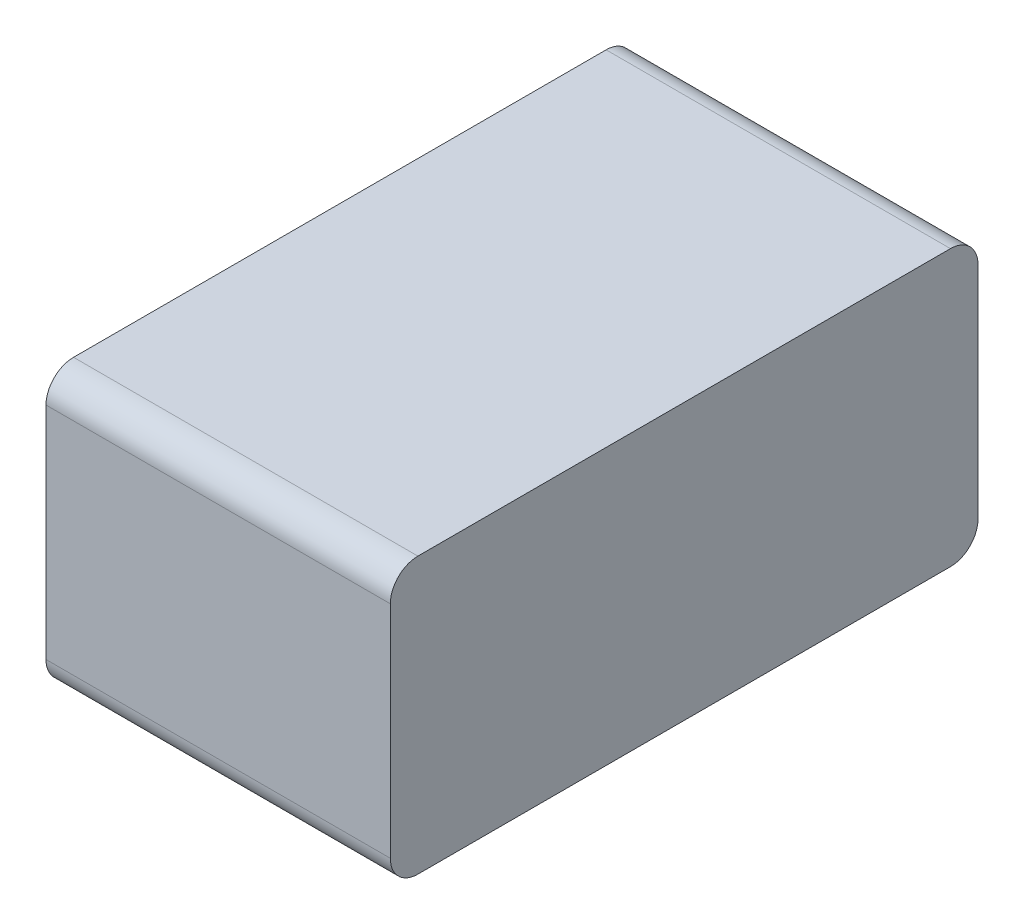
ISO-10303-21;
HEADER;
FILE_DESCRIPTION(('STEP AP214'),'2;1');
FILE_NAME('part.step','',(''),(''),'','','');
FILE_SCHEMA(('AUTOMOTIVE_DESIGN { 1 0 10303 214 1 1 1 1 }'));
ENDSEC;
DATA;
#1=APPLICATION_CONTEXT('core data for automotive mechanical design processes');
#2=APPLICATION_PROTOCOL_DEFINITION('international standard','automotive_design',2000,#1);
#3=PRODUCT_CONTEXT('',#1,'mechanical');
#4=PRODUCT('Part','Part','',(#3));
#5=PRODUCT_RELATED_PRODUCT_CATEGORY('part','',(#4));
#6=PRODUCT_DEFINITION_FORMATION('','',#4);
#7=PRODUCT_DEFINITION_CONTEXT('part definition',#1,'design');
#8=PRODUCT_DEFINITION('design','',#6,#7);
#9=PRODUCT_DEFINITION_SHAPE('','',#8);
#10=(LENGTH_UNIT() NAMED_UNIT(*) SI_UNIT(.MILLI.,.METRE.));
#11=(NAMED_UNIT(*) PLANE_ANGLE_UNIT() SI_UNIT($,.RADIAN.));
#12=(NAMED_UNIT(*) SI_UNIT($,.STERADIAN.) SOLID_ANGLE_UNIT());
#13=UNCERTAINTY_MEASURE_WITH_UNIT(LENGTH_MEASURE(1.E-05),#10,'distance_accuracy_value','');
#14=(GEOMETRIC_REPRESENTATION_CONTEXT(3) GLOBAL_UNCERTAINTY_ASSIGNED_CONTEXT((#13)) GLOBAL_UNIT_ASSIGNED_CONTEXT((#10,
#11,#12)) REPRESENTATION_CONTEXT('',''));
#15=CARTESIAN_POINT('',(0.,0.,0.));
#16=DIRECTION('',(0.,0.,1.));
#17=DIRECTION('',(1.,0.,0.));
#18=AXIS2_PLACEMENT_3D('',#15,#16,#17);
#19=CARTESIAN_POINT('',(37.5,-15.,32.));
#20=DIRECTION('',(0.,1.,0.));
#21=DIRECTION('',(0.,0.,1.));
#22=AXIS2_PLACEMENT_3D('',#19,#20,#21);
#23=PLANE('',#22);
#24=DIRECTION('',(0.,0.,-1.));
#25=VECTOR('',#24,1.);
#26=CARTESIAN_POINT('',(37.5,-15.,32.));
#27=LINE('',#26,#25);
#28=CARTESIAN_POINT('',(37.5,-15.,29.));
#29=VERTEX_POINT('',#28);
#30=CARTESIAN_POINT('',(37.5,-15.,-29.));
#31=VERTEX_POINT('',#30);
#32=EDGE_CURVE('E130',#29,#31,#27,.T.);
#33=ORIENTED_EDGE('',*,*,#32,.F.);
#34=DIRECTION('',(-1.,0.,0.));
#35=VECTOR('',#34,1.);
#36=CARTESIAN_POINT('',(37.5,-15.,29.));
#37=LINE('',#36,#35);
#38=CARTESIAN_POINT('',(0.,-15.,29.));
#39=VERTEX_POINT('',#38);
#40=EDGE_CURVE('E115',#29,#39,#37,.T.);
#41=ORIENTED_EDGE('',*,*,#40,.T.);
#42=DIRECTION('',(0.,0.,-1.));
#43=VECTOR('',#42,1.);
#44=CARTESIAN_POINT('',(0.,-15.,32.));
#45=LINE('',#44,#43);
#46=CARTESIAN_POINT('',(0.,-15.,-29.));
#47=VERTEX_POINT('',#46);
#48=EDGE_CURVE('E127',#39,#47,#45,.T.);
#49=ORIENTED_EDGE('',*,*,#48,.T.);
#50=DIRECTION('',(-1.,0.,0.));
#51=VECTOR('',#50,1.);
#52=CARTESIAN_POINT('',(37.5,-15.,-29.));
#53=LINE('',#52,#51);
#54=EDGE_CURVE('E132',#47,#31,#53,.F.);
#55=ORIENTED_EDGE('',*,*,#54,.T.);
#56=EDGE_LOOP('',(#33,#41,#49,#55));
#57=FACE_BOUND('',#56,.T.);
#58=ADVANCED_FACE('F45',(#57),#23,.F.);
#59=CARTESIAN_POINT('',(37.5,-15.,-32.));
#60=DIRECTION('',(0.,0.,1.));
#61=DIRECTION('',(1.,0.,0.));
#62=AXIS2_PLACEMENT_3D('',#59,#60,#61);
#63=PLANE('',#62);
#64=DIRECTION('',(0.,1.,0.));
#65=VECTOR('',#64,1.);
#66=CARTESIAN_POINT('',(0.,-15.,-32.));
#67=LINE('',#66,#65);
#68=CARTESIAN_POINT('',(0.,-12.,-32.));
#69=VERTEX_POINT('',#68);
#70=CARTESIAN_POINT('',(0.,12.,-32.));
#71=VERTEX_POINT('',#70);
#72=EDGE_CURVE('E136',#69,#71,#67,.T.);
#73=ORIENTED_EDGE('',*,*,#72,.T.);
#74=DIRECTION('',(-1.,0.,0.));
#75=VECTOR('',#74,1.);
#76=CARTESIAN_POINT('',(37.5,12.,-32.));
#77=LINE('',#76,#75);
#78=CARTESIAN_POINT('',(37.5,12.,-32.));
#79=VERTEX_POINT('',#78);
#80=EDGE_CURVE('E11',#71,#79,#77,.F.);
#81=ORIENTED_EDGE('',*,*,#80,.T.);
#82=DIRECTION('',(0.,1.,0.));
#83=VECTOR('',#82,1.);
#84=CARTESIAN_POINT('',(37.5,-15.,-32.));
#85=LINE('',#84,#83);
#86=CARTESIAN_POINT('',(37.5,-12.,-32.));
#87=VERTEX_POINT('',#86);
#88=EDGE_CURVE('E176',#87,#79,#85,.T.);
#89=ORIENTED_EDGE('',*,*,#88,.F.);
#90=DIRECTION('',(-1.,0.,0.));
#91=VECTOR('',#90,1.);
#92=CARTESIAN_POINT('',(37.5,-12.,-32.));
#93=LINE('',#92,#91);
#94=EDGE_CURVE('E53',#87,#69,#93,.T.);
#95=ORIENTED_EDGE('',*,*,#94,.T.);
#96=EDGE_LOOP('',(#73,#81,#89,#95));
#97=FACE_BOUND('',#96,.T.);
#98=ADVANCED_FACE('F174',(#97),#63,.F.);
#99=CARTESIAN_POINT('',(37.5,15.,-32.));
#100=DIRECTION('',(0.,-1.,0.));
#101=DIRECTION('',(0.,0.,-1.));
#102=AXIS2_PLACEMENT_3D('',#99,#100,#101);
#103=PLANE('',#102);
#104=DIRECTION('',(0.,0.,1.));
#105=VECTOR('',#104,1.);
#106=CARTESIAN_POINT('',(0.,15.,-32.));
#107=LINE('',#106,#105);
#108=CARTESIAN_POINT('',(0.,15.,-29.));
#109=VERTEX_POINT('',#108);
#110=CARTESIAN_POINT('',(0.,15.,29.));
#111=VERTEX_POINT('',#110);
#112=EDGE_CURVE('E140',#109,#111,#107,.T.);
#113=ORIENTED_EDGE('',*,*,#112,.T.);
#114=DIRECTION('',(-1.,0.,0.));
#115=VECTOR('',#114,1.);
#116=CARTESIAN_POINT('',(37.5,15.,29.));
#117=LINE('',#116,#115);
#118=CARTESIAN_POINT('',(37.5,15.,29.));
#119=VERTEX_POINT('',#118);
#120=EDGE_CURVE('E60',#111,#119,#117,.F.);
#121=ORIENTED_EDGE('',*,*,#120,.T.);
#122=DIRECTION('',(0.,0.,1.));
#123=VECTOR('',#122,1.);
#124=CARTESIAN_POINT('',(37.5,15.,-32.));
#125=LINE('',#124,#123);
#126=CARTESIAN_POINT('',(37.5,15.,-29.));
#127=VERTEX_POINT('',#126);
#128=EDGE_CURVE('E184',#127,#119,#125,.T.);
#129=ORIENTED_EDGE('',*,*,#128,.F.);
#130=DIRECTION('',(-1.,0.,0.));
#131=VECTOR('',#130,1.);
#132=CARTESIAN_POINT('',(37.5,15.,-29.));
#133=LINE('',#132,#131);
#134=EDGE_CURVE('E167',#127,#109,#133,.T.);
#135=ORIENTED_EDGE('',*,*,#134,.T.);
#136=EDGE_LOOP('',(#113,#121,#129,#135));
#137=FACE_BOUND('',#136,.T.);
#138=ADVANCED_FACE('F183',(#137),#103,.F.);
#139=CARTESIAN_POINT('',(37.5,15.,32.));
#140=DIRECTION('',(0.,0.,-1.));
#141=DIRECTION('',(-1.,0.,0.));
#142=AXIS2_PLACEMENT_3D('',#139,#140,#141);
#143=PLANE('',#142);
#144=DIRECTION('',(0.,-1.,0.));
#145=VECTOR('',#144,1.);
#146=CARTESIAN_POINT('',(0.,15.,32.));
#147=LINE('',#146,#145);
#148=CARTESIAN_POINT('',(0.,12.,32.));
#149=VERTEX_POINT('',#148);
#150=CARTESIAN_POINT('',(0.,-12.,32.));
#151=VERTEX_POINT('',#150);
#152=EDGE_CURVE('E150',#149,#151,#147,.T.);
#153=ORIENTED_EDGE('',*,*,#152,.T.);
#154=DIRECTION('',(-1.,0.,0.));
#155=VECTOR('',#154,1.);
#156=CARTESIAN_POINT('',(37.5,-12.,32.));
#157=LINE('',#156,#155);
#158=CARTESIAN_POINT('',(37.5,-12.,32.));
#159=VERTEX_POINT('',#158);
#160=EDGE_CURVE('E116',#151,#159,#157,.F.);
#161=ORIENTED_EDGE('',*,*,#160,.T.);
#162=DIRECTION('',(0.,-1.,0.));
#163=VECTOR('',#162,1.);
#164=CARTESIAN_POINT('',(37.5,15.,32.));
#165=LINE('',#164,#163);
#166=CARTESIAN_POINT('',(37.5,12.,32.));
#167=VERTEX_POINT('',#166);
#168=EDGE_CURVE('E146',#167,#159,#165,.T.);
#169=ORIENTED_EDGE('',*,*,#168,.F.);
#170=DIRECTION('',(-1.,0.,0.));
#171=VECTOR('',#170,1.);
#172=CARTESIAN_POINT('',(37.5,12.,32.));
#173=LINE('',#172,#171);
#174=EDGE_CURVE('E121',#167,#149,#173,.T.);
#175=ORIENTED_EDGE('',*,*,#174,.T.);
#176=EDGE_LOOP('',(#153,#161,#169,#175));
#177=FACE_BOUND('',#176,.T.);
#178=ADVANCED_FACE('F360',(#177),#143,.F.);
#179=CARTESIAN_POINT('',(37.5,0.,0.));
#180=DIRECTION('',(1.,0.,0.));
#181=DIRECTION('',(0.,0.,-1.));
#182=AXIS2_PLACEMENT_3D('',#179,#180,#181);
#183=PLANE('',#182);
#184=ORIENTED_EDGE('',*,*,#168,.T.);
#185=CARTESIAN_POINT('',(37.5,-12.,29.));
#186=DIRECTION('',(1.,0.,0.));
#187=DIRECTION('',(0.,0.,-1.));
#188=AXIS2_PLACEMENT_3D('',#185,#186,#187);
#189=CIRCLE('',#188,3.);
#190=EDGE_CURVE('E165',#159,#29,#189,.T.);
#191=ORIENTED_EDGE('',*,*,#190,.T.);
#192=ORIENTED_EDGE('',*,*,#32,.T.);
#193=CARTESIAN_POINT('',(37.5,-12.,-29.));
#194=DIRECTION('',(1.,0.,0.));
#195=DIRECTION('',(0.,0.,-1.));
#196=AXIS2_PLACEMENT_3D('',#193,#194,#195);
#197=CIRCLE('',#196,3.);
#198=EDGE_CURVE('E160',#31,#87,#197,.T.);
#199=ORIENTED_EDGE('',*,*,#198,.T.);
#200=ORIENTED_EDGE('',*,*,#88,.T.);
#201=CARTESIAN_POINT('',(37.5,12.,-29.));
#202=DIRECTION('',(1.,0.,0.));
#203=DIRECTION('',(0.,0.,-1.));
#204=AXIS2_PLACEMENT_3D('',#201,#202,#203);
#205=CIRCLE('',#204,3.);
#206=EDGE_CURVE('E67',#79,#127,#205,.T.);
#207=ORIENTED_EDGE('',*,*,#206,.T.);
#208=ORIENTED_EDGE('',*,*,#128,.T.);
#209=CARTESIAN_POINT('',(37.5,12.,29.));
#210=DIRECTION('',(1.,0.,0.));
#211=DIRECTION('',(0.,0.,-1.));
#212=AXIS2_PLACEMENT_3D('',#209,#210,#211);
#213=CIRCLE('',#212,3.);
#214=EDGE_CURVE('E163',#119,#167,#213,.T.);
#215=ORIENTED_EDGE('',*,*,#214,.T.);
#216=EDGE_LOOP('',(#184,#191,#192,#199,#200,#207,#208,#215));
#217=FACE_BOUND('',#216,.T.);
#218=ADVANCED_FACE('F209',(#217),#183,.T.);
#219=CARTESIAN_POINT('',(0.,0.,0.));
#220=DIRECTION('',(1.,0.,0.));
#221=DIRECTION('',(0.,0.,-1.));
#222=AXIS2_PLACEMENT_3D('',#219,#220,#221);
#223=PLANE('',#222);
#224=CARTESIAN_POINT('',(0.,3.,-20.));
#225=DIRECTION('',(-1.,0.,0.));
#226=DIRECTION('',(0.,0.,1.));
#227=AXIS2_PLACEMENT_3D('',#224,#225,#226);
#228=CIRCLE('',#227,5.5);
#229=CARTESIAN_POINT('',(0.,3.,-14.5));
#230=VERTEX_POINT('',#229);
#231=EDGE_CURVE('E143',#230,#230,#228,.T.);
#232=ORIENTED_EDGE('',*,*,#231,.F.);
#233=EDGE_LOOP('',(#232));
#234=FACE_BOUND('',#233,.T.);
#235=CARTESIAN_POINT('',(0.,3.,0.));
#236=DIRECTION('',(-1.,0.,0.));
#237=DIRECTION('',(0.,0.,1.));
#238=AXIS2_PLACEMENT_3D('',#235,#236,#237);
#239=CIRCLE('',#238,5.5);
#240=CARTESIAN_POINT('',(0.,3.,5.5));
#241=VERTEX_POINT('',#240);
#242=EDGE_CURVE('E199',#241,#241,#239,.T.);
#243=ORIENTED_EDGE('',*,*,#242,.F.);
#244=EDGE_LOOP('',(#243));
#245=FACE_BOUND('',#244,.T.);
#246=CARTESIAN_POINT('',(0.,3.,20.));
#247=DIRECTION('',(-1.,0.,0.));
#248=DIRECTION('',(0.,0.,1.));
#249=AXIS2_PLACEMENT_3D('',#246,#247,#248);
#250=CIRCLE('',#249,5.5);
#251=CARTESIAN_POINT('',(0.,3.,25.5));
#252=VERTEX_POINT('',#251);
#253=EDGE_CURVE('E193',#252,#252,#250,.T.);
#254=ORIENTED_EDGE('',*,*,#253,.F.);
#255=EDGE_LOOP('',(#254));
#256=FACE_BOUND('',#255,.T.);
#257=ORIENTED_EDGE('',*,*,#48,.F.);
#258=CARTESIAN_POINT('',(0.,-12.,29.));
#259=DIRECTION('',(1.,0.,0.));
#260=DIRECTION('',(0.,0.,-1.));
#261=AXIS2_PLACEMENT_3D('',#258,#259,#260);
#262=CIRCLE('',#261,3.);
#263=EDGE_CURVE('E111',#39,#151,#262,.F.);
#264=ORIENTED_EDGE('',*,*,#263,.T.);
#265=ORIENTED_EDGE('',*,*,#152,.F.);
#266=CARTESIAN_POINT('',(0.,12.,29.));
#267=DIRECTION('',(1.,0.,0.));
#268=DIRECTION('',(0.,0.,-1.));
#269=AXIS2_PLACEMENT_3D('',#266,#267,#268);
#270=CIRCLE('',#269,3.);
#271=EDGE_CURVE('E122',#149,#111,#270,.F.);
#272=ORIENTED_EDGE('',*,*,#271,.T.);
#273=ORIENTED_EDGE('',*,*,#112,.F.);
#274=CARTESIAN_POINT('',(0.,12.,-29.));
#275=DIRECTION('',(1.,0.,0.));
#276=DIRECTION('',(0.,0.,-1.));
#277=AXIS2_PLACEMENT_3D('',#274,#275,#276);
#278=CIRCLE('',#277,3.);
#279=EDGE_CURVE('E154',#109,#71,#278,.F.);
#280=ORIENTED_EDGE('',*,*,#279,.T.);
#281=ORIENTED_EDGE('',*,*,#72,.F.);
#282=CARTESIAN_POINT('',(0.,-12.,-29.));
#283=DIRECTION('',(1.,0.,0.));
#284=DIRECTION('',(0.,0.,-1.));
#285=AXIS2_PLACEMENT_3D('',#282,#283,#284);
#286=CIRCLE('',#285,3.);
#287=EDGE_CURVE('E131',#69,#47,#286,.F.);
#288=ORIENTED_EDGE('',*,*,#287,.T.);
#289=EDGE_LOOP('',(#257,#264,#265,#272,#273,#280,#281,#288));
#290=FACE_BOUND('',#289,.T.);
#291=ADVANCED_FACE('F134',(#234,#245,#256,#290),#223,.F.);
#292=CARTESIAN_POINT('',(37.5,-12.,29.));
#293=DIRECTION('',(-1.,0.,0.));
#294=DIRECTION('',(0.,0.,1.));
#295=AXIS2_PLACEMENT_3D('',#292,#293,#294);
#296=CYLINDRICAL_SURFACE('',#295,3.);
#297=ORIENTED_EDGE('',*,*,#190,.F.);
#298=ORIENTED_EDGE('',*,*,#160,.F.);
#299=ORIENTED_EDGE('',*,*,#263,.F.);
#300=ORIENTED_EDGE('',*,*,#40,.F.);
#301=EDGE_LOOP('',(#297,#298,#299,#300));
#302=FACE_BOUND('',#301,.T.);
#303=ADVANCED_FACE('F114',(#302),#296,.T.);
#304=CARTESIAN_POINT('',(37.5,12.,29.));
#305=DIRECTION('',(-1.,0.,0.));
#306=DIRECTION('',(0.,0.,1.));
#307=AXIS2_PLACEMENT_3D('',#304,#305,#306);
#308=CYLINDRICAL_SURFACE('',#307,3.);
#309=ORIENTED_EDGE('',*,*,#214,.F.);
#310=ORIENTED_EDGE('',*,*,#120,.F.);
#311=ORIENTED_EDGE('',*,*,#271,.F.);
#312=ORIENTED_EDGE('',*,*,#174,.F.);
#313=EDGE_LOOP('',(#309,#310,#311,#312));
#314=FACE_BOUND('',#313,.T.);
#315=ADVANCED_FACE('F239',(#314),#308,.T.);
#316=CARTESIAN_POINT('',(37.5,12.,-29.));
#317=DIRECTION('',(-1.,0.,0.));
#318=DIRECTION('',(0.,0.,1.));
#319=AXIS2_PLACEMENT_3D('',#316,#317,#318);
#320=CYLINDRICAL_SURFACE('',#319,3.);
#321=ORIENTED_EDGE('',*,*,#206,.F.);
#322=ORIENTED_EDGE('',*,*,#80,.F.);
#323=ORIENTED_EDGE('',*,*,#279,.F.);
#324=ORIENTED_EDGE('',*,*,#134,.F.);
#325=EDGE_LOOP('',(#321,#322,#323,#324));
#326=FACE_BOUND('',#325,.T.);
#327=ADVANCED_FACE('F182',(#326),#320,.T.);
#328=CARTESIAN_POINT('',(37.5,-12.,-29.));
#329=DIRECTION('',(-1.,0.,0.));
#330=DIRECTION('',(0.,0.,1.));
#331=AXIS2_PLACEMENT_3D('',#328,#329,#330);
#332=CYLINDRICAL_SURFACE('',#331,3.);
#333=ORIENTED_EDGE('',*,*,#198,.F.);
#334=ORIENTED_EDGE('',*,*,#54,.F.);
#335=ORIENTED_EDGE('',*,*,#287,.F.);
#336=ORIENTED_EDGE('',*,*,#94,.F.);
#337=EDGE_LOOP('',(#333,#334,#335,#336));
#338=FACE_BOUND('',#337,.T.);
#339=ADVANCED_FACE('F47',(#338),#332,.T.);
#340=CARTESIAN_POINT('',(36.5,3.,20.));
#341=DIRECTION('',(-1.,0.,0.));
#342=DIRECTION('',(0.,0.,1.));
#343=AXIS2_PLACEMENT_3D('',#340,#341,#342);
#344=CYLINDRICAL_SURFACE('',#343,5.5);
#345=CARTESIAN_POINT('',(36.5,3.,20.));
#346=DIRECTION('',(-1.,0.,0.));
#347=DIRECTION('',(0.,0.,1.));
#348=AXIS2_PLACEMENT_3D('',#345,#346,#347);
#349=CIRCLE('',#348,5.5);
#350=CARTESIAN_POINT('',(36.5,3.,25.5));
#351=VERTEX_POINT('',#350);
#352=EDGE_CURVE('E190',#351,#351,#349,.T.);
#353=ORIENTED_EDGE('',*,*,#352,.F.);
#354=EDGE_LOOP('',(#353));
#355=FACE_BOUND('',#354,.T.);
#356=ORIENTED_EDGE('',*,*,#253,.T.);
#357=EDGE_LOOP('',(#356));
#358=FACE_BOUND('',#357,.T.);
#359=ADVANCED_FACE('F215',(#355,#358),#344,.F.);
#360=CARTESIAN_POINT('',(36.5,3.,20.));
#361=DIRECTION('',(-1.,0.,0.));
#362=DIRECTION('',(0.,0.,1.));
#363=AXIS2_PLACEMENT_3D('',#360,#361,#362);
#364=PLANE('',#363);
#365=ORIENTED_EDGE('',*,*,#352,.T.);
#366=EDGE_LOOP('',(#365));
#367=FACE_BOUND('',#366,.T.);
#368=ADVANCED_FACE('F217',(#367),#364,.T.);
#369=CARTESIAN_POINT('',(36.5,3.,0.));
#370=DIRECTION('',(-1.,0.,0.));
#371=DIRECTION('',(0.,0.,1.));
#372=AXIS2_PLACEMENT_3D('',#369,#370,#371);
#373=CYLINDRICAL_SURFACE('',#372,5.5);
#374=CARTESIAN_POINT('',(36.5,3.,0.));
#375=DIRECTION('',(-1.,0.,0.));
#376=DIRECTION('',(0.,0.,1.));
#377=AXIS2_PLACEMENT_3D('',#374,#375,#376);
#378=CIRCLE('',#377,5.5);
#379=CARTESIAN_POINT('',(36.5,3.,5.5));
#380=VERTEX_POINT('',#379);
#381=EDGE_CURVE('E196',#380,#380,#378,.T.);
#382=ORIENTED_EDGE('',*,*,#381,.F.);
#383=EDGE_LOOP('',(#382));
#384=FACE_BOUND('',#383,.T.);
#385=ORIENTED_EDGE('',*,*,#242,.T.);
#386=EDGE_LOOP('',(#385));
#387=FACE_BOUND('',#386,.T.);
#388=ADVANCED_FACE('F223',(#384,#387),#373,.F.);
#389=CARTESIAN_POINT('',(36.5,3.,0.));
#390=DIRECTION('',(-1.,0.,0.));
#391=DIRECTION('',(0.,0.,1.));
#392=AXIS2_PLACEMENT_3D('',#389,#390,#391);
#393=PLANE('',#392);
#394=ORIENTED_EDGE('',*,*,#381,.T.);
#395=EDGE_LOOP('',(#394));
#396=FACE_BOUND('',#395,.T.);
#397=ADVANCED_FACE('F285',(#396),#393,.T.);
#398=CARTESIAN_POINT('',(36.5,3.,-20.));
#399=DIRECTION('',(-1.,0.,0.));
#400=DIRECTION('',(0.,0.,1.));
#401=AXIS2_PLACEMENT_3D('',#398,#399,#400);
#402=CYLINDRICAL_SURFACE('',#401,5.5);
#403=CARTESIAN_POINT('',(36.5,3.,-20.));
#404=DIRECTION('',(-1.,0.,0.));
#405=DIRECTION('',(0.,0.,1.));
#406=AXIS2_PLACEMENT_3D('',#403,#404,#405);
#407=CIRCLE('',#406,5.5);
#408=CARTESIAN_POINT('',(36.5,3.,-14.5));
#409=VERTEX_POINT('',#408);
#410=EDGE_CURVE('E137',#409,#409,#407,.T.);
#411=ORIENTED_EDGE('',*,*,#410,.F.);
#412=EDGE_LOOP('',(#411));
#413=FACE_BOUND('',#412,.T.);
#414=ORIENTED_EDGE('',*,*,#231,.T.);
#415=EDGE_LOOP('',(#414));
#416=FACE_BOUND('',#415,.T.);
#417=ADVANCED_FACE('F205',(#413,#416),#402,.F.);
#418=CARTESIAN_POINT('',(36.5,3.,-20.));
#419=DIRECTION('',(-1.,0.,0.));
#420=DIRECTION('',(0.,0.,1.));
#421=AXIS2_PLACEMENT_3D('',#418,#419,#420);
#422=PLANE('',#421);
#423=ORIENTED_EDGE('',*,*,#410,.T.);
#424=EDGE_LOOP('',(#423));
#425=FACE_BOUND('',#424,.T.);
#426=ADVANCED_FACE('F309',(#425),#422,.T.);
#427=CLOSED_SHELL('',(#58,#98,#138,#178,#218,#291,#303,#315,#327,#339,#359,#368,#388,#397,#417,#426));
#428=MANIFOLD_SOLID_BREP('B2',#427);
#429=ADVANCED_BREP_SHAPE_REPRESENTATION('',(#18,#428),#14);
#430=SHAPE_DEFINITION_REPRESENTATION(#9,#429);
ENDSEC;
END-ISO-10303-21;
